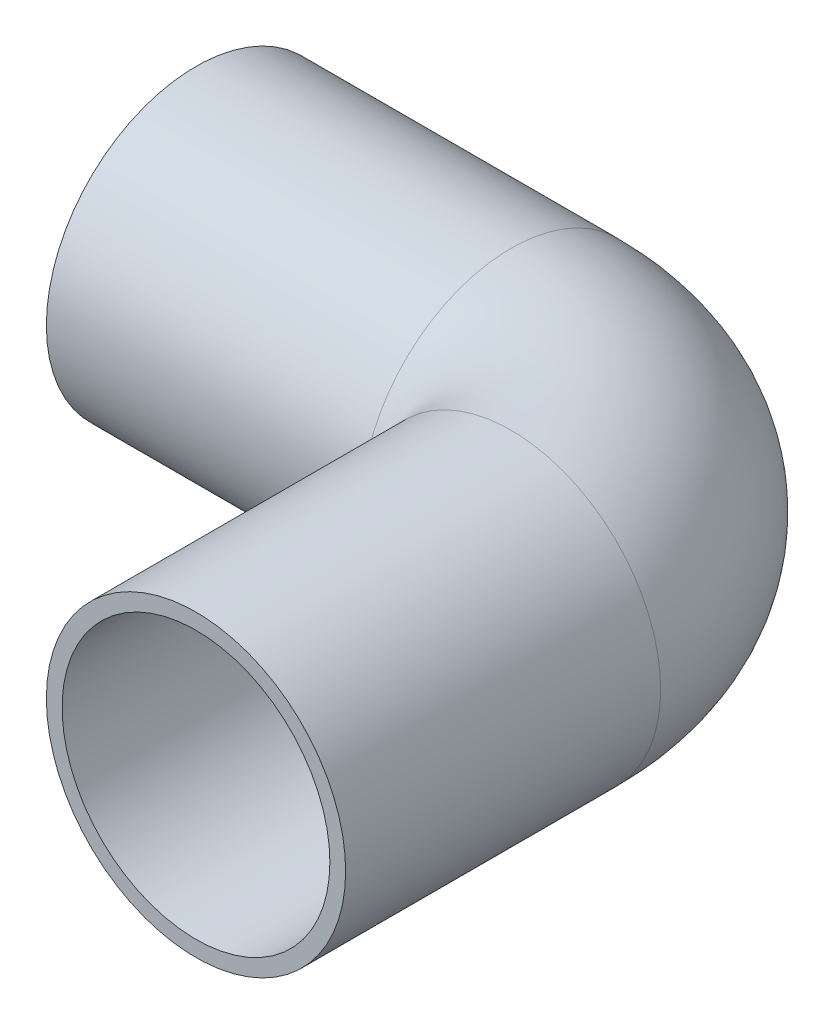
ISO-10303-21;
HEADER;
FILE_DESCRIPTION(('STEP AP214'),'2;1');
FILE_NAME('part.step','',(''),(''),'','','');
FILE_SCHEMA(('AUTOMOTIVE_DESIGN { 1 0 10303 214 1 1 1 1 }'));
ENDSEC;
DATA;
#1=APPLICATION_CONTEXT('core data for automotive mechanical design processes');
#2=APPLICATION_PROTOCOL_DEFINITION('international standard','automotive_design',2000,#1);
#3=PRODUCT_CONTEXT('',#1,'mechanical');
#4=PRODUCT('Part','Part','',(#3));
#5=PRODUCT_RELATED_PRODUCT_CATEGORY('part','',(#4));
#6=PRODUCT_DEFINITION_FORMATION('','',#4);
#7=PRODUCT_DEFINITION_CONTEXT('part definition',#1,'design');
#8=PRODUCT_DEFINITION('design','',#6,#7);
#9=PRODUCT_DEFINITION_SHAPE('','',#8);
#10=(LENGTH_UNIT() NAMED_UNIT(*) SI_UNIT(.MILLI.,.METRE.));
#11=(NAMED_UNIT(*) PLANE_ANGLE_UNIT() SI_UNIT($,.RADIAN.));
#12=(NAMED_UNIT(*) SI_UNIT($,.STERADIAN.) SOLID_ANGLE_UNIT());
#13=UNCERTAINTY_MEASURE_WITH_UNIT(LENGTH_MEASURE(1.E-05),#10,'distance_accuracy_value','');
#14=(GEOMETRIC_REPRESENTATION_CONTEXT(3) GLOBAL_UNCERTAINTY_ASSIGNED_CONTEXT((#13)) GLOBAL_UNIT_ASSIGNED_CONTEXT((#10,
#11,#12)) REPRESENTATION_CONTEXT('',''));
#15=CARTESIAN_POINT('',(0.,0.,0.));
#16=DIRECTION('',(0.,0.,1.));
#17=DIRECTION('',(1.,0.,0.));
#18=AXIS2_PLACEMENT_3D('',#15,#16,#17);
#19=CARTESIAN_POINT('',(0.,0.,0.));
#20=DIRECTION('',(0.,0.,-1.));
#21=DIRECTION('',(-1.,0.,0.));
#22=AXIS2_PLACEMENT_3D('',#19,#20,#21);
#23=CYLINDRICAL_SURFACE('',#22,19.);
#24=CARTESIAN_POINT('',(0.,0.,-39.9999999999998));
#25=DIRECTION('',(0.,0.,1.));
#26=DIRECTION('',(1.,0.,0.));
#27=AXIS2_PLACEMENT_3D('',#24,#25,#26);
#28=CIRCLE('',#27,19.);
#29=CARTESIAN_POINT('',(19.,0.,-39.9999999999997));
#30=VERTEX_POINT('',#29);
#31=EDGE_CURVE('E53',#30,#30,#28,.T.);
#32=ORIENTED_EDGE('',*,*,#31,.T.);
#33=EDGE_LOOP('',(#32));
#34=FACE_BOUND('',#33,.T.);
#35=CARTESIAN_POINT('',(0.,0.,0.));
#36=DIRECTION('',(0.,0.,1.));
#37=DIRECTION('',(1.,0.,0.));
#38=AXIS2_PLACEMENT_3D('',#35,#36,#37);
#39=CIRCLE('',#38,19.);
#40=CARTESIAN_POINT('',(19.,0.,0.));
#41=VERTEX_POINT('',#40);
#42=EDGE_CURVE('E51',#41,#41,#39,.T.);
#43=ORIENTED_EDGE('',*,*,#42,.F.);
#44=EDGE_LOOP('',(#43));
#45=FACE_BOUND('',#44,.T.);
#46=ADVANCED_FACE('F30',(#34,#45),#23,.T.);
#47=CARTESIAN_POINT('',(-20.,0.,-40.));
#48=DIRECTION('',(0.,1.,0.));
#49=DIRECTION('',(0.,0.,1.));
#50=AXIS2_PLACEMENT_3D('',#47,#48,#49);
#51=TOROIDAL_SURFACE('',#50,20.,19.);
#52=CARTESIAN_POINT('',(-20.0000000000001,0.,-60.));
#53=DIRECTION('',(1.,0.,0.));
#54=DIRECTION('',(0.,0.,-1.));
#55=AXIS2_PLACEMENT_3D('',#52,#53,#54);
#56=CIRCLE('',#55,19.);
#57=CARTESIAN_POINT('',(-20.0000000000003,0.,-79.));
#58=VERTEX_POINT('',#57);
#59=EDGE_CURVE('E34',#58,#58,#56,.T.);
#60=CARTESIAN_POINT('',(-20.,0.,-40.));
#61=DIRECTION('',(0.,1.,0.));
#62=DIRECTION('',(0.,0.,1.));
#63=AXIS2_PLACEMENT_3D('',#60,#61,#62);
#64=CIRCLE('',#63,39.);
#65=EDGE_CURVE('',#30,#58,#64,.T.);
#66=ORIENTED_EDGE('',*,*,#31,.F.);
#67=ORIENTED_EDGE('',*,*,#59,.T.);
#68=ORIENTED_EDGE('',*,*,#65,.T.);
#69=ORIENTED_EDGE('',*,*,#65,.F.);
#70=EDGE_LOOP('',(#66,#68,#67,#69));
#71=FACE_BOUND('',#70,.T.);
#72=ADVANCED_FACE('F60',(#71),#51,.T.);
#73=CARTESIAN_POINT('',(-20.0000000000001,0.,-60.));
#74=DIRECTION('',(-1.,0.,0.));
#75=DIRECTION('',(0.,0.,1.));
#76=AXIS2_PLACEMENT_3D('',#73,#74,#75);
#77=CYLINDRICAL_SURFACE('',#76,19.);
#78=CARTESIAN_POINT('',(-60.,0.,-60.));
#79=DIRECTION('',(1.,0.,0.));
#80=DIRECTION('',(0.,0.,-1.));
#81=AXIS2_PLACEMENT_3D('',#78,#79,#80);
#82=CIRCLE('',#81,19.);
#83=CARTESIAN_POINT('',(-60.,0.,-79.));
#84=VERTEX_POINT('',#83);
#85=EDGE_CURVE('E47',#84,#84,#82,.T.);
#86=ORIENTED_EDGE('',*,*,#85,.T.);
#87=EDGE_LOOP('',(#86));
#88=FACE_BOUND('',#87,.T.);
#89=ORIENTED_EDGE('',*,*,#59,.F.);
#90=EDGE_LOOP('',(#89));
#91=FACE_BOUND('',#90,.T.);
#92=ADVANCED_FACE('F32',(#88,#91),#77,.T.);
#93=CARTESIAN_POINT('',(0.,0.,0.));
#94=DIRECTION('',(0.,0.,1.));
#95=DIRECTION('',(1.,0.,0.));
#96=AXIS2_PLACEMENT_3D('',#93,#94,#95);
#97=PLANE('',#96);
#98=CARTESIAN_POINT('',(0.,0.,0.));
#99=DIRECTION('',(0.,0.,1.));
#100=DIRECTION('',(1.,0.,0.));
#101=AXIS2_PLACEMENT_3D('',#98,#99,#100);
#102=CIRCLE('',#101,17.);
#103=CARTESIAN_POINT('',(17.,0.,0.));
#104=VERTEX_POINT('',#103);
#105=EDGE_CURVE('E50',#104,#104,#102,.F.);
#106=ORIENTED_EDGE('',*,*,#105,.T.);
#107=EDGE_LOOP('',(#106));
#108=FACE_BOUND('',#107,.T.);
#109=ORIENTED_EDGE('',*,*,#42,.T.);
#110=EDGE_LOOP('',(#109));
#111=FACE_BOUND('',#110,.T.);
#112=ADVANCED_FACE('F64',(#108,#111),#97,.T.);
#113=CARTESIAN_POINT('',(-60.,0.,-60.));
#114=DIRECTION('',(1.,0.,0.));
#115=DIRECTION('',(0.,0.,-1.));
#116=AXIS2_PLACEMENT_3D('',#113,#114,#115);
#117=PLANE('',#116);
#118=CARTESIAN_POINT('',(-60.,0.,-60.));
#119=DIRECTION('',(1.,0.,0.));
#120=DIRECTION('',(0.,0.,-1.));
#121=AXIS2_PLACEMENT_3D('',#118,#119,#120);
#122=CIRCLE('',#121,17.);
#123=CARTESIAN_POINT('',(-60.,0.,-77.));
#124=VERTEX_POINT('',#123);
#125=EDGE_CURVE('E10',#124,#124,#122,.F.);
#126=ORIENTED_EDGE('',*,*,#125,.F.);
#127=EDGE_LOOP('',(#126));
#128=FACE_BOUND('',#127,.T.);
#129=ORIENTED_EDGE('',*,*,#85,.F.);
#130=EDGE_LOOP('',(#129));
#131=FACE_BOUND('',#130,.T.);
#132=ADVANCED_FACE('F70',(#128,#131),#117,.F.);
#133=CARTESIAN_POINT('',(0.,0.,0.));
#134=DIRECTION('',(0.,0.,-1.));
#135=DIRECTION('',(-1.,0.,0.));
#136=AXIS2_PLACEMENT_3D('',#133,#134,#135);
#137=CYLINDRICAL_SURFACE('',#136,17.);
#138=CARTESIAN_POINT('',(0.,0.,-39.9999999999998));
#139=DIRECTION('',(0.,0.,1.));
#140=DIRECTION('',(1.,0.,0.));
#141=AXIS2_PLACEMENT_3D('',#138,#139,#140);
#142=CIRCLE('',#141,17.);
#143=CARTESIAN_POINT('',(17.,0.,-39.9999999999997));
#144=VERTEX_POINT('',#143);
#145=EDGE_CURVE('E43',#144,#144,#142,.F.);
#146=ORIENTED_EDGE('',*,*,#145,.T.);
#147=EDGE_LOOP('',(#146));
#148=FACE_BOUND('',#147,.T.);
#149=ORIENTED_EDGE('',*,*,#105,.F.);
#150=EDGE_LOOP('',(#149));
#151=FACE_BOUND('',#150,.T.);
#152=ADVANCED_FACE('F80',(#148,#151),#137,.F.);
#153=CARTESIAN_POINT('',(-20.,0.,-40.));
#154=DIRECTION('',(0.,1.,0.));
#155=DIRECTION('',(0.,0.,1.));
#156=AXIS2_PLACEMENT_3D('',#153,#154,#155);
#157=TOROIDAL_SURFACE('',#156,20.,17.);
#158=CARTESIAN_POINT('',(-20.0000000000001,0.,-60.));
#159=DIRECTION('',(1.,0.,0.));
#160=DIRECTION('',(0.,0.,-1.));
#161=AXIS2_PLACEMENT_3D('',#158,#159,#160);
#162=CIRCLE('',#161,17.);
#163=CARTESIAN_POINT('',(-20.0000000000002,0.,-77.));
#164=VERTEX_POINT('',#163);
#165=EDGE_CURVE('E38',#164,#164,#162,.F.);
#166=CARTESIAN_POINT('',(-20.,0.,-40.));
#167=DIRECTION('',(0.,1.,0.));
#168=DIRECTION('',(0.,0.,1.));
#169=AXIS2_PLACEMENT_3D('',#166,#167,#168);
#170=CIRCLE('',#169,37.);
#171=EDGE_CURVE('',#144,#164,#170,.T.);
#172=ORIENTED_EDGE('',*,*,#145,.F.);
#173=ORIENTED_EDGE('',*,*,#165,.T.);
#174=ORIENTED_EDGE('',*,*,#171,.T.);
#175=ORIENTED_EDGE('',*,*,#171,.F.);
#176=EDGE_LOOP('',(#172,#174,#173,#175));
#177=FACE_BOUND('',#176,.T.);
#178=ADVANCED_FACE('F75',(#177),#157,.F.);
#179=CARTESIAN_POINT('',(-20.0000000000001,0.,-60.));
#180=DIRECTION('',(-1.,0.,0.));
#181=DIRECTION('',(0.,0.,1.));
#182=AXIS2_PLACEMENT_3D('',#179,#180,#181);
#183=CYLINDRICAL_SURFACE('',#182,17.);
#184=ORIENTED_EDGE('',*,*,#125,.T.);
#185=EDGE_LOOP('',(#184));
#186=FACE_BOUND('',#185,.T.);
#187=ORIENTED_EDGE('',*,*,#165,.F.);
#188=EDGE_LOOP('',(#187));
#189=FACE_BOUND('',#188,.T.);
#190=ADVANCED_FACE('F73',(#186,#189),#183,.F.);
#191=CLOSED_SHELL('',(#46,#72,#92,#112,#132,#152,#178,#190));
#192=MANIFOLD_SOLID_BREP('B2',#191);
#193=ADVANCED_BREP_SHAPE_REPRESENTATION('',(#18,#192),#14);
#194=SHAPE_DEFINITION_REPRESENTATION(#9,#193);
ENDSEC;
END-ISO-10303-21;
